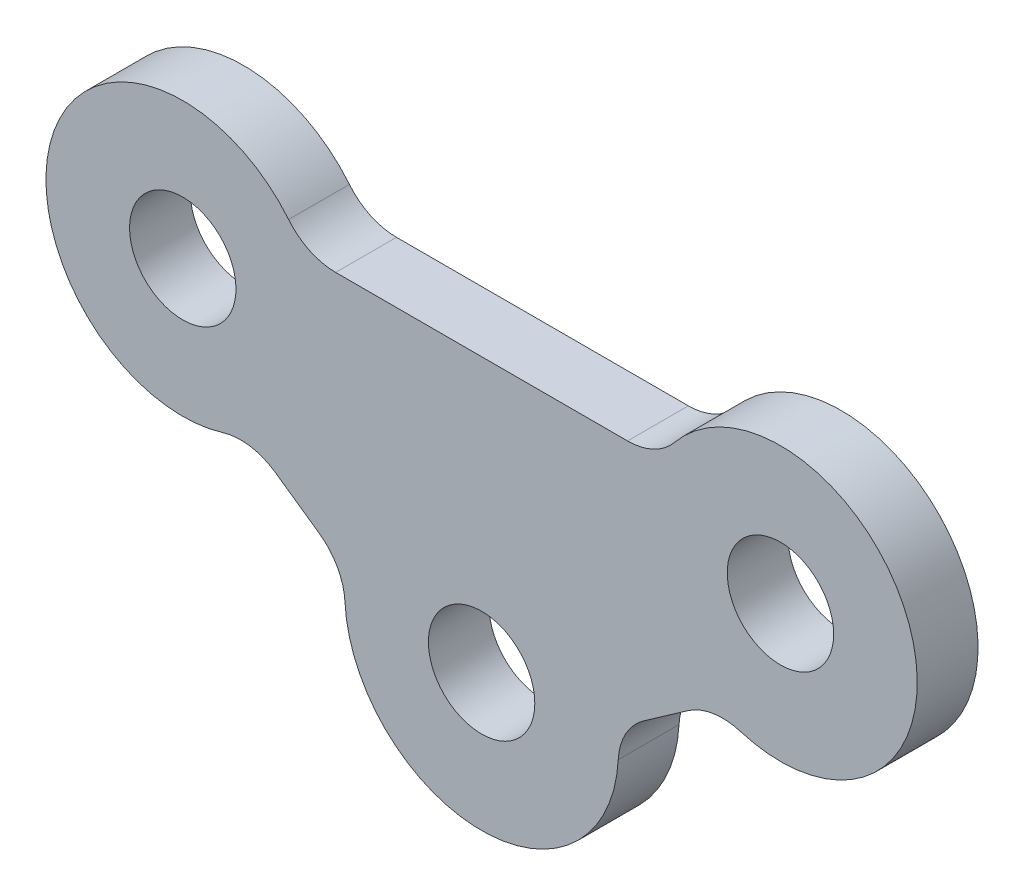
ISO-10303-21;
HEADER;
FILE_DESCRIPTION(('STEP AP214'),'2;1');
FILE_NAME('part.step','',(''),(''),'','','');
FILE_SCHEMA(('AUTOMOTIVE_DESIGN { 1 0 10303 214 1 1 1 1 }'));
ENDSEC;
DATA;
#1=APPLICATION_CONTEXT('core data for automotive mechanical design processes');
#2=APPLICATION_PROTOCOL_DEFINITION('international standard','automotive_design',2000,#1);
#3=PRODUCT_CONTEXT('',#1,'mechanical');
#4=PRODUCT('Part','Part','',(#3));
#5=PRODUCT_RELATED_PRODUCT_CATEGORY('part','',(#4));
#6=PRODUCT_DEFINITION_FORMATION('','',#4);
#7=PRODUCT_DEFINITION_CONTEXT('part definition',#1,'design');
#8=PRODUCT_DEFINITION('design','',#6,#7);
#9=PRODUCT_DEFINITION_SHAPE('','',#8);
#10=(LENGTH_UNIT() NAMED_UNIT(*) SI_UNIT(.MILLI.,.METRE.));
#11=(NAMED_UNIT(*) PLANE_ANGLE_UNIT() SI_UNIT($,.RADIAN.));
#12=(NAMED_UNIT(*) SI_UNIT($,.STERADIAN.) SOLID_ANGLE_UNIT());
#13=UNCERTAINTY_MEASURE_WITH_UNIT(LENGTH_MEASURE(1.E-05),#10,'distance_accuracy_value','');
#14=(GEOMETRIC_REPRESENTATION_CONTEXT(3) GLOBAL_UNCERTAINTY_ASSIGNED_CONTEXT((#13)) GLOBAL_UNIT_ASSIGNED_CONTEXT((#10,
#11,#12)) REPRESENTATION_CONTEXT('',''));
#15=CARTESIAN_POINT('',(0.,0.,0.));
#16=DIRECTION('',(0.,0.,1.));
#17=DIRECTION('',(1.,0.,0.));
#18=AXIS2_PLACEMENT_3D('',#15,#16,#17);
#19=CARTESIAN_POINT('',(-7.92722494303986,0.667604307154734,2.));
#20=DIRECTION('',(0.,0.,1.));
#21=DIRECTION('',(1.,0.,0.));
#22=AXIS2_PLACEMENT_3D('',#19,#20,#21);
#23=PLANE('',#22);
#24=CARTESIAN_POINT('',(9.82982453146789,6.88291723621257,2.));
#25=DIRECTION('',(0.,0.,1.));
#26=DIRECTION('',(1.,0.,0.));
#27=AXIS2_PLACEMENT_3D('',#24,#25,#26);
#28=CIRCLE('',#27,1.75);
#29=CARTESIAN_POINT('',(11.5798245314679,6.88291723621257,2.));
#30=VERTEX_POINT('',#29);
#31=EDGE_CURVE('E288',#30,#30,#28,.T.);
#32=ORIENTED_EDGE('',*,*,#31,.F.);
#33=EDGE_LOOP('',(#32));
#34=FACE_BOUND('',#33,.T.);
#35=CARTESIAN_POINT('',(-7.92722494303986,0.667604307154734,2.));
#36=DIRECTION('',(0.,0.,-1.));
#37=DIRECTION('',(1.,0.,0.));
#38=AXIS2_PLACEMENT_3D('',#35,#36,#37);
#39=CIRCLE('',#38,2.);
#40=CARTESIAN_POINT('',(-8.51264020101771,2.58000828532638,2.));
#41=VERTEX_POINT('',#40);
#42=CARTESIAN_POINT('',(-6.78007207033776,2.30590839573272,2.));
#43=VERTEX_POINT('',#42);
#44=EDGE_CURVE('E179',#41,#43,#39,.T.);
#45=ORIENTED_EDGE('',*,*,#44,.T.);
#46=DIRECTION('',(0.819152044288991,-0.573576436351048,0.));
#47=VECTOR('',#46,1.);
#48=CARTESIAN_POINT('',(-6.78007207033776,2.30590839573272,2.));
#49=LINE('',#48,#47);
#50=CARTESIAN_POINT('',(-5.34405820653432,1.30040066332389,2.));
#51=VERTEX_POINT('',#50);
#52=EDGE_CURVE('E107',#43,#51,#49,.T.);
#53=ORIENTED_EDGE('',*,*,#52,.T.);
#54=CARTESIAN_POINT('',(-6.49121107923641,-0.337903425254091,2.));
#55=DIRECTION('',(0.,0.,-1.));
#56=DIRECTION('',(-1.,0.,0.));
#57=AXIS2_PLACEMENT_3D('',#54,#55,#56);
#58=CIRCLE('',#57,2.);
#59=CARTESIAN_POINT('',(-4.49391536254829,-0.233933140560524,2.));
#60=VERTEX_POINT('',#59);
#61=EDGE_CURVE('E206',#51,#60,#58,.T.);
#62=ORIENTED_EDGE('',*,*,#61,.T.);
#63=CARTESIAN_POINT('',(0.,0.,2.));
#64=DIRECTION('',(0.,0.,1.));
#65=DIRECTION('',(1.,0.,0.));
#66=AXIS2_PLACEMENT_3D('',#63,#64,#65);
#67=CIRCLE('',#66,4.5);
#68=CARTESIAN_POINT('',(4.49391536254829,-0.233933140560526,2.));
#69=VERTEX_POINT('',#68);
#70=EDGE_CURVE('E225',#60,#69,#67,.T.);
#71=ORIENTED_EDGE('',*,*,#70,.T.);
#72=CARTESIAN_POINT('',(6.49121107923641,-0.337903425254091,2.));
#73=DIRECTION('',(0.,0.,-1.));
#74=DIRECTION('',(1.,0.,0.));
#75=AXIS2_PLACEMENT_3D('',#72,#73,#74);
#76=CIRCLE('',#75,2.);
#77=CARTESIAN_POINT('',(5.34405820653432,1.30040066332389,2.));
#78=VERTEX_POINT('',#77);
#79=EDGE_CURVE('E222',#69,#78,#76,.T.);
#80=ORIENTED_EDGE('',*,*,#79,.T.);
#81=DIRECTION('',(0.819152044288991,0.573576436351048,0.));
#82=VECTOR('',#81,1.);
#83=CARTESIAN_POINT('',(6.78007207033776,2.30590839573272,2.));
#84=LINE('',#83,#82);
#85=CARTESIAN_POINT('',(6.78007207033776,2.30590839573272,2.));
#86=VERTEX_POINT('',#85);
#87=EDGE_CURVE('E224',#78,#86,#84,.T.);
#88=ORIENTED_EDGE('',*,*,#87,.T.);
#89=CARTESIAN_POINT('',(7.92722494303986,0.667604307154734,2.));
#90=DIRECTION('',(0.,0.,-1.));
#91=DIRECTION('',(-1.,0.,0.));
#92=AXIS2_PLACEMENT_3D('',#89,#90,#91);
#93=CIRCLE('',#92,2.);
#94=CARTESIAN_POINT('',(8.51264020101772,2.58000828532637,2.));
#95=VERTEX_POINT('',#94);
#96=EDGE_CURVE('E227',#86,#95,#93,.T.);
#97=ORIENTED_EDGE('',*,*,#96,.T.);
#98=CARTESIAN_POINT('',(9.82982453146789,6.88291723621257,2.));
#99=DIRECTION('',(0.,0.,1.));
#100=DIRECTION('',(1.,0.,0.));
#101=AXIS2_PLACEMENT_3D('',#98,#99,#100);
#102=CIRCLE('',#101,4.5);
#103=CARTESIAN_POINT('',(6.34760427224192,9.73320530345002,2.));
#104=VERTEX_POINT('',#103);
#105=EDGE_CURVE('E233',#95,#104,#102,.T.);
#106=ORIENTED_EDGE('',*,*,#105,.T.);
#107=CARTESIAN_POINT('',(4.79995082369704,11.,2.));
#108=DIRECTION('',(0.,0.,-1.));
#109=DIRECTION('',(1.,0.,0.));
#110=AXIS2_PLACEMENT_3D('',#107,#108,#109);
#111=CIRCLE('',#110,2.);
#112=CARTESIAN_POINT('',(4.79995082369704,9.,2.));
#113=VERTEX_POINT('',#112);
#114=EDGE_CURVE('E138',#104,#113,#111,.T.);
#115=ORIENTED_EDGE('',*,*,#114,.T.);
#116=DIRECTION('',(-1.,0.,0.));
#117=VECTOR('',#116,1.);
#118=CARTESIAN_POINT('',(4.79995082369704,8.99999999999999,2.));
#119=LINE('',#118,#117);
#120=CARTESIAN_POINT('',(-4.79995082369704,8.99999999999999,2.));
#121=VERTEX_POINT('',#120);
#122=EDGE_CURVE('E132',#113,#121,#119,.T.);
#123=ORIENTED_EDGE('',*,*,#122,.T.);
#124=CARTESIAN_POINT('',(-4.79995082369704,11.,2.));
#125=DIRECTION('',(0.,0.,-1.));
#126=DIRECTION('',(1.,0.,0.));
#127=AXIS2_PLACEMENT_3D('',#124,#125,#126);
#128=CIRCLE('',#127,2.);
#129=CARTESIAN_POINT('',(-6.34760427224192,9.73320530345002,2.));
#130=VERTEX_POINT('',#129);
#131=EDGE_CURVE('E136',#121,#130,#128,.T.);
#132=ORIENTED_EDGE('',*,*,#131,.T.);
#133=CARTESIAN_POINT('',(-9.82982453146789,6.88291723621257,2.));
#134=DIRECTION('',(0.,0.,1.));
#135=DIRECTION('',(-1.,0.,0.));
#136=AXIS2_PLACEMENT_3D('',#133,#134,#135);
#137=CIRCLE('',#136,4.5);
#138=EDGE_CURVE('E52',#130,#41,#137,.T.);
#139=ORIENTED_EDGE('',*,*,#138,.T.);
#140=EDGE_LOOP('',(#45,#53,#62,#71,#80,#88,#97,#106,#115,#123,#132,#139));
#141=FACE_BOUND('',#140,.T.);
#142=CARTESIAN_POINT('',(0.,0.,2.));
#143=DIRECTION('',(0.,0.,1.));
#144=DIRECTION('',(1.,0.,0.));
#145=AXIS2_PLACEMENT_3D('',#142,#143,#144);
#146=CIRCLE('',#145,1.75);
#147=CARTESIAN_POINT('',(1.75,0.,2.));
#148=VERTEX_POINT('',#147);
#149=EDGE_CURVE('E160',#148,#148,#146,.T.);
#150=ORIENTED_EDGE('',*,*,#149,.F.);
#151=EDGE_LOOP('',(#150));
#152=FACE_BOUND('',#151,.T.);
#153=CARTESIAN_POINT('',(-9.82982453146789,6.88291723621257,2.));
#154=DIRECTION('',(0.,0.,1.));
#155=DIRECTION('',(-1.,0.,0.));
#156=AXIS2_PLACEMENT_3D('',#153,#154,#155);
#157=CIRCLE('',#156,1.75);
#158=CARTESIAN_POINT('',(-11.5798245314679,6.88291723621257,2.));
#159=VERTEX_POINT('',#158);
#160=EDGE_CURVE('E279',#159,#159,#157,.T.);
#161=ORIENTED_EDGE('',*,*,#160,.F.);
#162=EDGE_LOOP('',(#161));
#163=FACE_BOUND('',#162,.T.);
#164=ADVANCED_FACE('F35',(#34,#141,#152,#163),#23,.T.);
#165=CARTESIAN_POINT('',(-7.92722494303986,0.667604307154734,0.));
#166=DIRECTION('',(0.,0.,1.));
#167=DIRECTION('',(1.,0.,0.));
#168=AXIS2_PLACEMENT_3D('',#165,#166,#167);
#169=PLANE('',#168);
#170=CARTESIAN_POINT('',(-7.92722494303986,0.667604307154734,0.));
#171=DIRECTION('',(0.,0.,-1.));
#172=DIRECTION('',(1.,0.,0.));
#173=AXIS2_PLACEMENT_3D('',#170,#171,#172);
#174=CIRCLE('',#173,2.);
#175=CARTESIAN_POINT('',(-8.51264020101771,2.58000828532638,0.));
#176=VERTEX_POINT('',#175);
#177=CARTESIAN_POINT('',(-6.78007207033776,2.30590839573272,0.));
#178=VERTEX_POINT('',#177);
#179=EDGE_CURVE('E156',#176,#178,#174,.T.);
#180=ORIENTED_EDGE('',*,*,#179,.F.);
#181=CARTESIAN_POINT('',(-9.82982453146789,6.88291723621257,0.));
#182=DIRECTION('',(0.,0.,1.));
#183=DIRECTION('',(-1.,0.,0.));
#184=AXIS2_PLACEMENT_3D('',#181,#182,#183);
#185=CIRCLE('',#184,4.5);
#186=CARTESIAN_POINT('',(-6.34760427224192,9.73320530345002,0.));
#187=VERTEX_POINT('',#186);
#188=EDGE_CURVE('E99',#187,#176,#185,.T.);
#189=ORIENTED_EDGE('',*,*,#188,.F.);
#190=CARTESIAN_POINT('',(-4.79995082369704,11.,0.));
#191=DIRECTION('',(0.,0.,-1.));
#192=DIRECTION('',(1.,0.,0.));
#193=AXIS2_PLACEMENT_3D('',#190,#191,#192);
#194=CIRCLE('',#193,2.);
#195=CARTESIAN_POINT('',(-4.79995082369704,8.99999999999999,0.));
#196=VERTEX_POINT('',#195);
#197=EDGE_CURVE('E93',#196,#187,#194,.T.);
#198=ORIENTED_EDGE('',*,*,#197,.F.);
#199=DIRECTION('',(-1.,0.,0.));
#200=VECTOR('',#199,1.);
#201=CARTESIAN_POINT('',(4.79995082369704,8.99999999999999,0.));
#202=LINE('',#201,#200);
#203=CARTESIAN_POINT('',(4.79995082369704,9.,0.));
#204=VERTEX_POINT('',#203);
#205=EDGE_CURVE('E146',#204,#196,#202,.T.);
#206=ORIENTED_EDGE('',*,*,#205,.F.);
#207=CARTESIAN_POINT('',(4.79995082369704,11.,0.));
#208=DIRECTION('',(0.,0.,-1.));
#209=DIRECTION('',(1.,0.,0.));
#210=AXIS2_PLACEMENT_3D('',#207,#208,#209);
#211=CIRCLE('',#210,2.);
#212=CARTESIAN_POINT('',(6.34760427224192,9.73320530345002,0.));
#213=VERTEX_POINT('',#212);
#214=EDGE_CURVE('E174',#213,#204,#211,.T.);
#215=ORIENTED_EDGE('',*,*,#214,.F.);
#216=CARTESIAN_POINT('',(9.82982453146789,6.88291723621257,0.));
#217=DIRECTION('',(0.,0.,1.));
#218=DIRECTION('',(1.,0.,0.));
#219=AXIS2_PLACEMENT_3D('',#216,#217,#218);
#220=CIRCLE('',#219,4.5);
#221=CARTESIAN_POINT('',(8.51264020101772,2.58000828532637,0.));
#222=VERTEX_POINT('',#221);
#223=EDGE_CURVE('E172',#222,#213,#220,.T.);
#224=ORIENTED_EDGE('',*,*,#223,.F.);
#225=CARTESIAN_POINT('',(7.92722494303986,0.667604307154734,0.));
#226=DIRECTION('',(0.,0.,-1.));
#227=DIRECTION('',(-1.,0.,0.));
#228=AXIS2_PLACEMENT_3D('',#225,#226,#227);
#229=CIRCLE('',#228,2.);
#230=CARTESIAN_POINT('',(6.78007207033776,2.30590839573272,0.));
#231=VERTEX_POINT('',#230);
#232=EDGE_CURVE('E170',#231,#222,#229,.T.);
#233=ORIENTED_EDGE('',*,*,#232,.F.);
#234=DIRECTION('',(0.819152044288991,0.573576436351048,0.));
#235=VECTOR('',#234,1.);
#236=CARTESIAN_POINT('',(6.78007207033776,2.30590839573272,0.));
#237=LINE('',#236,#235);
#238=CARTESIAN_POINT('',(5.34405820653432,1.30040066332389,0.));
#239=VERTEX_POINT('',#238);
#240=EDGE_CURVE('E168',#239,#231,#237,.T.);
#241=ORIENTED_EDGE('',*,*,#240,.F.);
#242=CARTESIAN_POINT('',(6.49121107923641,-0.337903425254091,0.));
#243=DIRECTION('',(0.,0.,-1.));
#244=DIRECTION('',(1.,0.,0.));
#245=AXIS2_PLACEMENT_3D('',#242,#243,#244);
#246=CIRCLE('',#245,2.);
#247=CARTESIAN_POINT('',(4.49391536254829,-0.233933140560526,0.));
#248=VERTEX_POINT('',#247);
#249=EDGE_CURVE('E166',#248,#239,#246,.T.);
#250=ORIENTED_EDGE('',*,*,#249,.F.);
#251=CARTESIAN_POINT('',(0.,0.,0.));
#252=DIRECTION('',(0.,0.,1.));
#253=DIRECTION('',(1.,0.,0.));
#254=AXIS2_PLACEMENT_3D('',#251,#252,#253);
#255=CIRCLE('',#254,4.5);
#256=CARTESIAN_POINT('',(-4.49391536254829,-0.233933140560524,0.));
#257=VERTEX_POINT('',#256);
#258=EDGE_CURVE('E164',#257,#248,#255,.T.);
#259=ORIENTED_EDGE('',*,*,#258,.F.);
#260=CARTESIAN_POINT('',(-6.49121107923641,-0.337903425254091,0.));
#261=DIRECTION('',(0.,0.,-1.));
#262=DIRECTION('',(-1.,0.,0.));
#263=AXIS2_PLACEMENT_3D('',#260,#261,#262);
#264=CIRCLE('',#263,2.);
#265=CARTESIAN_POINT('',(-5.34405820653432,1.30040066332389,0.));
#266=VERTEX_POINT('',#265);
#267=EDGE_CURVE('E162',#266,#257,#264,.T.);
#268=ORIENTED_EDGE('',*,*,#267,.F.);
#269=DIRECTION('',(0.819152044288991,-0.573576436351048,0.));
#270=VECTOR('',#269,1.);
#271=CARTESIAN_POINT('',(-6.78007207033776,2.30590839573272,0.));
#272=LINE('',#271,#270);
#273=EDGE_CURVE('E159',#178,#266,#272,.T.);
#274=ORIENTED_EDGE('',*,*,#273,.F.);
#275=EDGE_LOOP('',(#180,#189,#198,#206,#215,#224,#233,#241,#250,#259,#268,#274));
#276=FACE_BOUND('',#275,.T.);
#277=CARTESIAN_POINT('',(0.,0.,0.));
#278=DIRECTION('',(0.,0.,1.));
#279=DIRECTION('',(1.,0.,0.));
#280=AXIS2_PLACEMENT_3D('',#277,#278,#279);
#281=CIRCLE('',#280,1.75);
#282=CARTESIAN_POINT('',(1.75,0.,0.));
#283=VERTEX_POINT('',#282);
#284=EDGE_CURVE('E291',#283,#283,#281,.T.);
#285=ORIENTED_EDGE('',*,*,#284,.T.);
#286=EDGE_LOOP('',(#285));
#287=FACE_BOUND('',#286,.T.);
#288=CARTESIAN_POINT('',(9.82982453146789,6.88291723621257,0.));
#289=DIRECTION('',(0.,0.,1.));
#290=DIRECTION('',(1.,0.,0.));
#291=AXIS2_PLACEMENT_3D('',#288,#289,#290);
#292=CIRCLE('',#291,1.75);
#293=CARTESIAN_POINT('',(11.5798245314679,6.88291723621257,0.));
#294=VERTEX_POINT('',#293);
#295=EDGE_CURVE('E285',#294,#294,#292,.T.);
#296=ORIENTED_EDGE('',*,*,#295,.T.);
#297=EDGE_LOOP('',(#296));
#298=FACE_BOUND('',#297,.T.);
#299=CARTESIAN_POINT('',(-9.82982453146789,6.88291723621257,0.));
#300=DIRECTION('',(0.,0.,1.));
#301=DIRECTION('',(-1.,0.,0.));
#302=AXIS2_PLACEMENT_3D('',#299,#300,#301);
#303=CIRCLE('',#302,1.75);
#304=CARTESIAN_POINT('',(-11.5798245314679,6.88291723621257,0.));
#305=VERTEX_POINT('',#304);
#306=EDGE_CURVE('E282',#305,#305,#303,.T.);
#307=ORIENTED_EDGE('',*,*,#306,.T.);
#308=EDGE_LOOP('',(#307));
#309=FACE_BOUND('',#308,.T.);
#310=ADVANCED_FACE('F210',(#276,#287,#298,#309),#169,.F.);
#311=CARTESIAN_POINT('',(-7.92722494303986,0.667604307154734,2.));
#312=DIRECTION('',(0.,0.,-1.));
#313=DIRECTION('',(-1.,0.,0.));
#314=AXIS2_PLACEMENT_3D('',#311,#312,#313);
#315=CYLINDRICAL_SURFACE('',#314,2.);
#316=ORIENTED_EDGE('',*,*,#179,.T.);
#317=DIRECTION('',(0.,0.,-1.));
#318=VECTOR('',#317,1.);
#319=CARTESIAN_POINT('',(-6.78007207033776,2.30590839573272,2.));
#320=LINE('',#319,#318);
#321=EDGE_CURVE('E11',#43,#178,#320,.T.);
#322=ORIENTED_EDGE('',*,*,#321,.F.);
#323=ORIENTED_EDGE('',*,*,#44,.F.);
#324=DIRECTION('',(0.,0.,-1.));
#325=VECTOR('',#324,1.);
#326=CARTESIAN_POINT('',(-8.51264020101771,2.58000828532638,2.));
#327=LINE('',#326,#325);
#328=EDGE_CURVE('E152',#41,#176,#327,.T.);
#329=ORIENTED_EDGE('',*,*,#328,.T.);
#330=EDGE_LOOP('',(#316,#322,#323,#329));
#331=FACE_BOUND('',#330,.T.);
#332=ADVANCED_FACE('F37',(#331),#315,.F.);
#333=CARTESIAN_POINT('',(-6.78007207033776,2.30590839573272,2.));
#334=DIRECTION('',(0.573576436351048,0.819152044288991,0.));
#335=DIRECTION('',(-0.819152044288991,0.573576436351048,0.));
#336=AXIS2_PLACEMENT_3D('',#333,#334,#335);
#337=PLANE('',#336);
#338=ORIENTED_EDGE('',*,*,#273,.T.);
#339=DIRECTION('',(0.,0.,-1.));
#340=VECTOR('',#339,1.);
#341=CARTESIAN_POINT('',(-5.34405820653432,1.30040066332389,2.));
#342=LINE('',#341,#340);
#343=EDGE_CURVE('E44',#51,#266,#342,.T.);
#344=ORIENTED_EDGE('',*,*,#343,.F.);
#345=ORIENTED_EDGE('',*,*,#52,.F.);
#346=ORIENTED_EDGE('',*,*,#321,.T.);
#347=EDGE_LOOP('',(#338,#344,#345,#346));
#348=FACE_BOUND('',#347,.T.);
#349=ADVANCED_FACE('F373',(#348),#337,.F.);
#350=CARTESIAN_POINT('',(-6.49121107923641,-0.337903425254091,2.));
#351=DIRECTION('',(0.,0.,-1.));
#352=DIRECTION('',(-1.,0.,0.));
#353=AXIS2_PLACEMENT_3D('',#350,#351,#352);
#354=CYLINDRICAL_SURFACE('',#353,2.);
#355=ORIENTED_EDGE('',*,*,#267,.T.);
#356=DIRECTION('',(0.,0.,-1.));
#357=VECTOR('',#356,1.);
#358=CARTESIAN_POINT('',(-4.49391536254829,-0.233933140560524,2.));
#359=LINE('',#358,#357);
#360=EDGE_CURVE('E198',#60,#257,#359,.T.);
#361=ORIENTED_EDGE('',*,*,#360,.F.);
#362=ORIENTED_EDGE('',*,*,#61,.F.);
#363=ORIENTED_EDGE('',*,*,#343,.T.);
#364=EDGE_LOOP('',(#355,#361,#362,#363));
#365=FACE_BOUND('',#364,.T.);
#366=ADVANCED_FACE('F204',(#365),#354,.F.);
#367=CARTESIAN_POINT('',(0.,0.,2.));
#368=DIRECTION('',(0.,0.,-1.));
#369=DIRECTION('',(-1.,0.,0.));
#370=AXIS2_PLACEMENT_3D('',#367,#368,#369);
#371=CYLINDRICAL_SURFACE('',#370,4.5);
#372=ORIENTED_EDGE('',*,*,#258,.T.);
#373=DIRECTION('',(0.,0.,-1.));
#374=VECTOR('',#373,1.);
#375=CARTESIAN_POINT('',(4.49391536254829,-0.233933140560526,2.));
#376=LINE('',#375,#374);
#377=EDGE_CURVE('E195',#69,#248,#376,.T.);
#378=ORIENTED_EDGE('',*,*,#377,.F.);
#379=ORIENTED_EDGE('',*,*,#70,.F.);
#380=ORIENTED_EDGE('',*,*,#360,.T.);
#381=EDGE_LOOP('',(#372,#378,#379,#380));
#382=FACE_BOUND('',#381,.T.);
#383=ADVANCED_FACE('F216',(#382),#371,.T.);
#384=CARTESIAN_POINT('',(6.49121107923641,-0.337903425254091,2.));
#385=DIRECTION('',(0.,0.,-1.));
#386=DIRECTION('',(-1.,0.,0.));
#387=AXIS2_PLACEMENT_3D('',#384,#385,#386);
#388=CYLINDRICAL_SURFACE('',#387,2.);
#389=ORIENTED_EDGE('',*,*,#249,.T.);
#390=DIRECTION('',(0.,0.,-1.));
#391=VECTOR('',#390,1.);
#392=CARTESIAN_POINT('',(5.34405820653432,1.30040066332389,2.));
#393=LINE('',#392,#391);
#394=EDGE_CURVE('E192',#78,#239,#393,.T.);
#395=ORIENTED_EDGE('',*,*,#394,.F.);
#396=ORIENTED_EDGE('',*,*,#79,.F.);
#397=ORIENTED_EDGE('',*,*,#377,.T.);
#398=EDGE_LOOP('',(#389,#395,#396,#397));
#399=FACE_BOUND('',#398,.T.);
#400=ADVANCED_FACE('F220',(#399),#388,.F.);
#401=CARTESIAN_POINT('',(6.78007207033776,2.30590839573272,2.));
#402=DIRECTION('',(-0.573576436351048,0.819152044288991,0.));
#403=DIRECTION('',(-0.819152044288991,-0.573576436351048,0.));
#404=AXIS2_PLACEMENT_3D('',#401,#402,#403);
#405=PLANE('',#404);
#406=ORIENTED_EDGE('',*,*,#240,.T.);
#407=DIRECTION('',(0.,0.,-1.));
#408=VECTOR('',#407,1.);
#409=CARTESIAN_POINT('',(6.78007207033776,2.30590839573272,2.));
#410=LINE('',#409,#408);
#411=EDGE_CURVE('E189',#86,#231,#410,.T.);
#412=ORIENTED_EDGE('',*,*,#411,.F.);
#413=ORIENTED_EDGE('',*,*,#87,.F.);
#414=ORIENTED_EDGE('',*,*,#394,.T.);
#415=EDGE_LOOP('',(#406,#412,#413,#414));
#416=FACE_BOUND('',#415,.T.);
#417=ADVANCED_FACE('F346',(#416),#405,.F.);
#418=CARTESIAN_POINT('',(7.92722494303986,0.667604307154734,2.));
#419=DIRECTION('',(0.,0.,-1.));
#420=DIRECTION('',(-1.,0.,0.));
#421=AXIS2_PLACEMENT_3D('',#418,#419,#420);
#422=CYLINDRICAL_SURFACE('',#421,2.);
#423=ORIENTED_EDGE('',*,*,#232,.T.);
#424=DIRECTION('',(0.,0.,-1.));
#425=VECTOR('',#424,1.);
#426=CARTESIAN_POINT('',(8.51264020101772,2.58000828532637,2.));
#427=LINE('',#426,#425);
#428=EDGE_CURVE('E186',#95,#222,#427,.T.);
#429=ORIENTED_EDGE('',*,*,#428,.F.);
#430=ORIENTED_EDGE('',*,*,#96,.F.);
#431=ORIENTED_EDGE('',*,*,#411,.T.);
#432=EDGE_LOOP('',(#423,#429,#430,#431));
#433=FACE_BOUND('',#432,.T.);
#434=ADVANCED_FACE('F339',(#433),#422,.F.);
#435=CARTESIAN_POINT('',(9.82982453146789,6.88291723621257,2.));
#436=DIRECTION('',(0.,0.,-1.));
#437=DIRECTION('',(-1.,0.,0.));
#438=AXIS2_PLACEMENT_3D('',#435,#436,#437);
#439=CYLINDRICAL_SURFACE('',#438,4.5);
#440=ORIENTED_EDGE('',*,*,#223,.T.);
#441=DIRECTION('',(0.,0.,-1.));
#442=VECTOR('',#441,1.);
#443=CARTESIAN_POINT('',(6.34760427224192,9.73320530345002,2.));
#444=LINE('',#443,#442);
#445=EDGE_CURVE('E183',#104,#213,#444,.T.);
#446=ORIENTED_EDGE('',*,*,#445,.F.);
#447=ORIENTED_EDGE('',*,*,#105,.F.);
#448=ORIENTED_EDGE('',*,*,#428,.T.);
#449=EDGE_LOOP('',(#440,#446,#447,#448));
#450=FACE_BOUND('',#449,.T.);
#451=ADVANCED_FACE('F239',(#450),#439,.T.);
#452=CARTESIAN_POINT('',(4.79995082369704,11.,2.));
#453=DIRECTION('',(0.,0.,-1.));
#454=DIRECTION('',(-1.,0.,0.));
#455=AXIS2_PLACEMENT_3D('',#452,#453,#454);
#456=CYLINDRICAL_SURFACE('',#455,2.);
#457=ORIENTED_EDGE('',*,*,#214,.T.);
#458=DIRECTION('',(0.,0.,-1.));
#459=VECTOR('',#458,1.);
#460=CARTESIAN_POINT('',(4.79995082369704,9.,2.));
#461=LINE('',#460,#459);
#462=EDGE_CURVE('E147',#113,#204,#461,.T.);
#463=ORIENTED_EDGE('',*,*,#462,.F.);
#464=ORIENTED_EDGE('',*,*,#114,.F.);
#465=ORIENTED_EDGE('',*,*,#445,.T.);
#466=EDGE_LOOP('',(#457,#463,#464,#465));
#467=FACE_BOUND('',#466,.T.);
#468=ADVANCED_FACE('F243',(#467),#456,.F.);
#469=CARTESIAN_POINT('',(4.79995082369704,8.99999999999999,2.));
#470=DIRECTION('',(0.,-1.,0.));
#471=DIRECTION('',(0.,0.,-1.));
#472=AXIS2_PLACEMENT_3D('',#469,#470,#471);
#473=PLANE('',#472);
#474=ORIENTED_EDGE('',*,*,#205,.T.);
#475=DIRECTION('',(0.,0.,-1.));
#476=VECTOR('',#475,1.);
#477=CARTESIAN_POINT('',(-4.79995082369704,8.99999999999999,2.));
#478=LINE('',#477,#476);
#479=EDGE_CURVE('E143',#121,#196,#478,.T.);
#480=ORIENTED_EDGE('',*,*,#479,.F.);
#481=ORIENTED_EDGE('',*,*,#122,.F.);
#482=ORIENTED_EDGE('',*,*,#462,.T.);
#483=EDGE_LOOP('',(#474,#480,#481,#482));
#484=FACE_BOUND('',#483,.T.);
#485=ADVANCED_FACE('F144',(#484),#473,.F.);
#486=CARTESIAN_POINT('',(-4.79995082369704,11.,2.));
#487=DIRECTION('',(0.,0.,-1.));
#488=DIRECTION('',(-1.,0.,0.));
#489=AXIS2_PLACEMENT_3D('',#486,#487,#488);
#490=CYLINDRICAL_SURFACE('',#489,2.);
#491=ORIENTED_EDGE('',*,*,#197,.T.);
#492=DIRECTION('',(0.,0.,-1.));
#493=VECTOR('',#492,1.);
#494=CARTESIAN_POINT('',(-6.34760427224192,9.73320530345002,2.));
#495=LINE('',#494,#493);
#496=EDGE_CURVE('E148',#130,#187,#495,.T.);
#497=ORIENTED_EDGE('',*,*,#496,.F.);
#498=ORIENTED_EDGE('',*,*,#131,.F.);
#499=ORIENTED_EDGE('',*,*,#479,.T.);
#500=EDGE_LOOP('',(#491,#497,#498,#499));
#501=FACE_BOUND('',#500,.T.);
#502=ADVANCED_FACE('F150',(#501),#490,.F.);
#503=CARTESIAN_POINT('',(-9.82982453146789,6.88291723621257,2.));
#504=DIRECTION('',(0.,0.,-1.));
#505=DIRECTION('',(-1.,0.,0.));
#506=AXIS2_PLACEMENT_3D('',#503,#504,#505);
#507=CYLINDRICAL_SURFACE('',#506,4.5);
#508=ORIENTED_EDGE('',*,*,#188,.T.);
#509=ORIENTED_EDGE('',*,*,#328,.F.);
#510=ORIENTED_EDGE('',*,*,#138,.F.);
#511=ORIENTED_EDGE('',*,*,#496,.T.);
#512=EDGE_LOOP('',(#508,#509,#510,#511));
#513=FACE_BOUND('',#512,.T.);
#514=ADVANCED_FACE('F247',(#513),#507,.T.);
#515=CARTESIAN_POINT('',(0.,0.,2.));
#516=DIRECTION('',(0.,0.,-1.));
#517=DIRECTION('',(-1.,0.,0.));
#518=AXIS2_PLACEMENT_3D('',#515,#516,#517);
#519=CYLINDRICAL_SURFACE('',#518,1.75);
#520=ORIENTED_EDGE('',*,*,#149,.T.);
#521=EDGE_LOOP('',(#520));
#522=FACE_BOUND('',#521,.T.);
#523=ORIENTED_EDGE('',*,*,#284,.F.);
#524=EDGE_LOOP('',(#523));
#525=FACE_BOUND('',#524,.T.);
#526=ADVANCED_FACE('F249',(#522,#525),#519,.F.);
#527=CARTESIAN_POINT('',(9.82982453146789,6.88291723621257,2.));
#528=DIRECTION('',(0.,0.,-1.));
#529=DIRECTION('',(-1.,0.,0.));
#530=AXIS2_PLACEMENT_3D('',#527,#528,#529);
#531=CYLINDRICAL_SURFACE('',#530,1.75);
#532=ORIENTED_EDGE('',*,*,#31,.T.);
#533=EDGE_LOOP('',(#532));
#534=FACE_BOUND('',#533,.T.);
#535=ORIENTED_EDGE('',*,*,#295,.F.);
#536=EDGE_LOOP('',(#535));
#537=FACE_BOUND('',#536,.T.);
#538=ADVANCED_FACE('F255',(#534,#537),#531,.F.);
#539=CARTESIAN_POINT('',(-9.82982453146789,6.88291723621257,2.));
#540=DIRECTION('',(0.,0.,-1.));
#541=DIRECTION('',(-1.,0.,0.));
#542=AXIS2_PLACEMENT_3D('',#539,#540,#541);
#543=CYLINDRICAL_SURFACE('',#542,1.75);
#544=ORIENTED_EDGE('',*,*,#160,.T.);
#545=EDGE_LOOP('',(#544));
#546=FACE_BOUND('',#545,.T.);
#547=ORIENTED_EDGE('',*,*,#306,.F.);
#548=EDGE_LOOP('',(#547));
#549=FACE_BOUND('',#548,.T.);
#550=ADVANCED_FACE('F270',(#546,#549),#543,.F.);
#551=CLOSED_SHELL('',(#164,#310,#332,#349,#366,#383,#400,#417,#434,#451,#468,#485,#502,#514,
#526,#538,#550));
#552=MANIFOLD_SOLID_BREP('B2',#551);
#553=ADVANCED_BREP_SHAPE_REPRESENTATION('',(#18,#552),#14);
#554=SHAPE_DEFINITION_REPRESENTATION(#9,#553);
ENDSEC;
END-ISO-10303-21;
